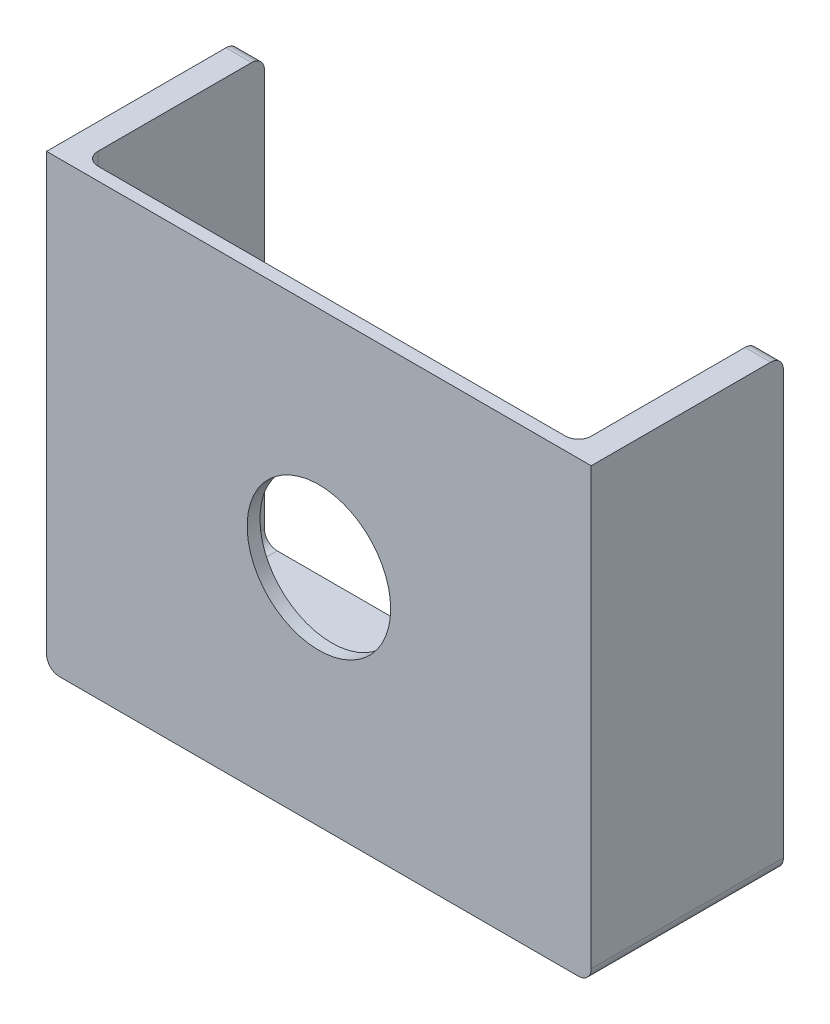
ISO-10303-21;
HEADER;
FILE_DESCRIPTION(('STEP AP214'),'2;1');
FILE_NAME('part.step','',(''),(''),'','','');
FILE_SCHEMA(('AUTOMOTIVE_DESIGN { 1 0 10303 214 1 1 1 1 }'));
ENDSEC;
DATA;
#1=APPLICATION_CONTEXT('core data for automotive mechanical design processes');
#2=APPLICATION_PROTOCOL_DEFINITION('international standard','automotive_design',2000,#1);
#3=PRODUCT_CONTEXT('',#1,'mechanical');
#4=PRODUCT('Part','Part','',(#3));
#5=PRODUCT_RELATED_PRODUCT_CATEGORY('part','',(#4));
#6=PRODUCT_DEFINITION_FORMATION('','',#4);
#7=PRODUCT_DEFINITION_CONTEXT('part definition',#1,'design');
#8=PRODUCT_DEFINITION('design','',#6,#7);
#9=PRODUCT_DEFINITION_SHAPE('','',#8);
#10=(LENGTH_UNIT() NAMED_UNIT(*) SI_UNIT(.MILLI.,.METRE.));
#11=(NAMED_UNIT(*) PLANE_ANGLE_UNIT() SI_UNIT($,.RADIAN.));
#12=(NAMED_UNIT(*) SI_UNIT($,.STERADIAN.) SOLID_ANGLE_UNIT());
#13=UNCERTAINTY_MEASURE_WITH_UNIT(LENGTH_MEASURE(1.E-05),#10,'distance_accuracy_value','');
#14=(GEOMETRIC_REPRESENTATION_CONTEXT(3) GLOBAL_UNCERTAINTY_ASSIGNED_CONTEXT((#13)) GLOBAL_UNIT_ASSIGNED_CONTEXT((#10,
#11,#12)) REPRESENTATION_CONTEXT('',''));
#15=CARTESIAN_POINT('',(0.,0.,0.));
#16=DIRECTION('',(0.,0.,1.));
#17=DIRECTION('',(1.,0.,0.));
#18=AXIS2_PLACEMENT_3D('',#15,#16,#17);
#19=CARTESIAN_POINT('',(0.,0.,0.));
#20=DIRECTION('',(0.,0.,-1.));
#21=DIRECTION('',(-1.,0.,0.));
#22=AXIS2_PLACEMENT_3D('',#19,#20,#21);
#23=PLANE('',#22);
#24=DIRECTION('',(-1.,0.,0.));
#25=VECTOR('',#24,1.);
#26=CARTESIAN_POINT('',(0.,70.,0.));
#27=LINE('',#26,#25);
#28=CARTESIAN_POINT('',(79.,70.,0.));
#29=VERTEX_POINT('',#28);
#30=CARTESIAN_POINT('',(6.,70.,0.));
#31=VERTEX_POINT('',#30);
#32=EDGE_CURVE('E185',#29,#31,#27,.T.);
#33=ORIENTED_EDGE('',*,*,#32,.F.);
#34=DIRECTION('',(0.,1.,0.));
#35=VECTOR('',#34,1.);
#36=CARTESIAN_POINT('',(79.,0.,0.));
#37=LINE('',#36,#35);
#38=CARTESIAN_POINT('',(79.,6.,0.));
#39=VERTEX_POINT('',#38);
#40=EDGE_CURVE('E235',#29,#39,#37,.F.);
#41=ORIENTED_EDGE('',*,*,#40,.T.);
#42=DIRECTION('',(1.,0.,0.));
#43=VECTOR('',#42,1.);
#44=CARTESIAN_POINT('',(4.,6.,0.));
#45=LINE('',#44,#43);
#46=CARTESIAN_POINT('',(6.,6.,0.));
#47=VERTEX_POINT('',#46);
#48=EDGE_CURVE('E231',#39,#47,#45,.F.);
#49=ORIENTED_EDGE('',*,*,#48,.T.);
#50=DIRECTION('',(0.,1.,0.));
#51=VECTOR('',#50,1.);
#52=CARTESIAN_POINT('',(6.,70.,0.));
#53=LINE('',#52,#51);
#54=EDGE_CURVE('E233',#47,#31,#53,.T.);
#55=ORIENTED_EDGE('',*,*,#54,.T.);
#56=EDGE_LOOP('',(#33,#41,#49,#55));
#57=FACE_BOUND('',#56,.T.);
#58=CARTESIAN_POINT('',(42.5,35.,0.));
#59=DIRECTION('',(0.,0.,-1.));
#60=DIRECTION('',(-1.,0.,0.));
#61=AXIS2_PLACEMENT_3D('',#58,#59,#60);
#62=CIRCLE('',#61,11.2);
#63=CARTESIAN_POINT('',(31.3,35.,0.));
#64=VERTEX_POINT('',#63);
#65=EDGE_CURVE('E188',#64,#64,#62,.T.);
#66=ORIENTED_EDGE('',*,*,#65,.F.);
#67=EDGE_LOOP('',(#66));
#68=FACE_BOUND('',#67,.T.);
#69=ADVANCED_FACE('F38',(#57,#68),#23,.T.);
#70=CARTESIAN_POINT('',(-28.2842712474619,4.,0.));
#71=DIRECTION('',(0.,1.,0.));
#72=DIRECTION('',(0.,0.,1.));
#73=AXIS2_PLACEMENT_3D('',#70,#71,#72);
#74=PLANE('',#73);
#75=CARTESIAN_POINT('',(15.,4.,-13.));
#76=DIRECTION('',(0.,1.,0.));
#77=DIRECTION('',(0.,0.,1.));
#78=AXIS2_PLACEMENT_3D('',#75,#76,#77);
#79=CIRCLE('',#78,2.39999999999999);
#80=CARTESIAN_POINT('',(15.,4.,-10.6));
#81=VERTEX_POINT('',#80);
#82=EDGE_CURVE('E262',#81,#81,#79,.T.);
#83=ORIENTED_EDGE('',*,*,#82,.F.);
#84=EDGE_LOOP('',(#83));
#85=FACE_BOUND('',#84,.T.);
#86=CARTESIAN_POINT('',(70.,4.,-13.));
#87=DIRECTION('',(0.,1.,0.));
#88=DIRECTION('',(0.,0.,1.));
#89=AXIS2_PLACEMENT_3D('',#86,#87,#88);
#90=CIRCLE('',#89,2.4);
#91=CARTESIAN_POINT('',(70.,4.,-10.6));
#92=VERTEX_POINT('',#91);
#93=EDGE_CURVE('E270',#92,#92,#90,.T.);
#94=ORIENTED_EDGE('',*,*,#93,.F.);
#95=EDGE_LOOP('',(#94));
#96=FACE_BOUND('',#95,.T.);
#97=DIRECTION('',(1.,0.,0.));
#98=VECTOR('',#97,1.);
#99=CARTESIAN_POINT('',(-28.2842712474619,4.,-28.));
#100=LINE('',#99,#98);
#101=CARTESIAN_POINT('',(6.,4.,-28.));
#102=VERTEX_POINT('',#101);
#103=CARTESIAN_POINT('',(79.,4.,-28.));
#104=VERTEX_POINT('',#103);
#105=EDGE_CURVE('E294',#102,#104,#100,.T.);
#106=ORIENTED_EDGE('',*,*,#105,.F.);
#107=DIRECTION('',(0.,0.,1.));
#108=VECTOR('',#107,1.);
#109=CARTESIAN_POINT('',(6.,4.,0.));
#110=LINE('',#109,#108);
#111=CARTESIAN_POINT('',(6.,4.,-2.));
#112=VERTEX_POINT('',#111);
#113=EDGE_CURVE('E55',#102,#112,#110,.T.);
#114=ORIENTED_EDGE('',*,*,#113,.T.);
#115=DIRECTION('',(1.,0.,0.));
#116=VECTOR('',#115,1.);
#117=CARTESIAN_POINT('',(81.,4.,-2.));
#118=LINE('',#117,#116);
#119=CARTESIAN_POINT('',(79.,4.,-2.));
#120=VERTEX_POINT('',#119);
#121=EDGE_CURVE('E60',#112,#120,#118,.T.);
#122=ORIENTED_EDGE('',*,*,#121,.T.);
#123=DIRECTION('',(0.,0.,1.));
#124=VECTOR('',#123,1.);
#125=CARTESIAN_POINT('',(79.,4.,0.));
#126=LINE('',#125,#124);
#127=EDGE_CURVE('E237',#120,#104,#126,.F.);
#128=ORIENTED_EDGE('',*,*,#127,.T.);
#129=EDGE_LOOP('',(#106,#114,#122,#128));
#130=FACE_BOUND('',#129,.T.);
#131=ADVANCED_FACE('F364',(#85,#96,#130),#74,.T.);
#132=CARTESIAN_POINT('',(0.,0.,2.));
#133=DIRECTION('',(1.,0.,0.));
#134=DIRECTION('',(0.,0.,-1.));
#135=AXIS2_PLACEMENT_3D('',#132,#133,#134);
#136=PLANE('',#135);
#137=DIRECTION('',(0.,-1.,0.));
#138=VECTOR('',#137,1.);
#139=CARTESIAN_POINT('',(0.,0.,-28.));
#140=LINE('',#139,#138);
#141=CARTESIAN_POINT('',(0.,68.,-28.));
#142=VERTEX_POINT('',#141);
#143=CARTESIAN_POINT('',(0.,2.,-28.));
#144=VERTEX_POINT('',#143);
#145=EDGE_CURVE('E290',#142,#144,#140,.T.);
#146=ORIENTED_EDGE('',*,*,#145,.T.);
#147=DIRECTION('',(0.,0.,-1.));
#148=VECTOR('',#147,1.);
#149=CARTESIAN_POINT('',(0.,2.,2.));
#150=LINE('',#149,#148);
#151=CARTESIAN_POINT('',(0.,2.,2.));
#152=VERTEX_POINT('',#151);
#153=EDGE_CURVE('E212',#144,#152,#150,.F.);
#154=ORIENTED_EDGE('',*,*,#153,.T.);
#155=DIRECTION('',(0.,-1.,0.));
#156=VECTOR('',#155,1.);
#157=CARTESIAN_POINT('',(0.,0.,2.));
#158=LINE('',#157,#156);
#159=CARTESIAN_POINT('',(0.,70.,2.));
#160=VERTEX_POINT('',#159);
#161=EDGE_CURVE('E187',#160,#152,#158,.T.);
#162=ORIENTED_EDGE('',*,*,#161,.F.);
#163=DIRECTION('',(0.,0.,-1.));
#164=VECTOR('',#163,1.);
#165=CARTESIAN_POINT('',(0.,70.,2.));
#166=LINE('',#165,#164);
#167=CARTESIAN_POINT('',(0.,70.,-26.));
#168=VERTEX_POINT('',#167);
#169=EDGE_CURVE('E175',#160,#168,#166,.T.);
#170=ORIENTED_EDGE('',*,*,#169,.T.);
#171=CARTESIAN_POINT('',(0.,68.,-26.));
#172=DIRECTION('',(1.,0.,0.));
#173=DIRECTION('',(0.,0.,-1.));
#174=AXIS2_PLACEMENT_3D('',#171,#172,#173);
#175=CIRCLE('',#174,2.);
#176=EDGE_CURVE('E210',#168,#142,#175,.F.);
#177=ORIENTED_EDGE('',*,*,#176,.T.);
#178=EDGE_LOOP('',(#146,#154,#162,#170,#177));
#179=FACE_BOUND('',#178,.T.);
#180=ADVANCED_FACE('F352',(#179),#136,.F.);
#181=CARTESIAN_POINT('',(0.,0.,2.));
#182=DIRECTION('',(0.,1.,0.));
#183=DIRECTION('',(0.,0.,1.));
#184=AXIS2_PLACEMENT_3D('',#181,#182,#183);
#185=PLANE('',#184);
#186=CARTESIAN_POINT('',(15.,0.,-13.));
#187=DIRECTION('',(0.,1.,0.));
#188=DIRECTION('',(0.,0.,1.));
#189=AXIS2_PLACEMENT_3D('',#186,#187,#188);
#190=CIRCLE('',#189,2.4);
#191=CARTESIAN_POINT('',(15.,0.,-10.6));
#192=VERTEX_POINT('',#191);
#193=EDGE_CURVE('E265',#192,#192,#190,.T.);
#194=ORIENTED_EDGE('',*,*,#193,.T.);
#195=EDGE_LOOP('',(#194));
#196=FACE_BOUND('',#195,.T.);
#197=CARTESIAN_POINT('',(70.,0.,-13.));
#198=DIRECTION('',(0.,1.,0.));
#199=DIRECTION('',(0.,0.,1.));
#200=AXIS2_PLACEMENT_3D('',#197,#198,#199);
#201=CIRCLE('',#200,2.4);
#202=CARTESIAN_POINT('',(70.,0.,-10.6));
#203=VERTEX_POINT('',#202);
#204=EDGE_CURVE('E275',#203,#203,#201,.T.);
#205=ORIENTED_EDGE('',*,*,#204,.T.);
#206=EDGE_LOOP('',(#205));
#207=FACE_BOUND('',#206,.T.);
#208=DIRECTION('',(1.,0.,0.));
#209=VECTOR('',#208,1.);
#210=CARTESIAN_POINT('',(-28.2842712474619,0.,-28.));
#211=LINE('',#210,#209);
#212=CARTESIAN_POINT('',(2.,0.,-28.));
#213=VERTEX_POINT('',#212);
#214=CARTESIAN_POINT('',(83.,0.,-28.));
#215=VERTEX_POINT('',#214);
#216=EDGE_CURVE('E296',#213,#215,#211,.T.);
#217=ORIENTED_EDGE('',*,*,#216,.T.);
#218=DIRECTION('',(0.,0.,-1.));
#219=VECTOR('',#218,1.);
#220=CARTESIAN_POINT('',(83.,0.,2.));
#221=LINE('',#220,#219);
#222=CARTESIAN_POINT('',(83.,0.,2.));
#223=VERTEX_POINT('',#222);
#224=EDGE_CURVE('E205',#215,#223,#221,.F.);
#225=ORIENTED_EDGE('',*,*,#224,.T.);
#226=DIRECTION('',(1.,0.,0.));
#227=VECTOR('',#226,1.);
#228=CARTESIAN_POINT('',(0.,0.,2.));
#229=LINE('',#228,#227);
#230=CARTESIAN_POINT('',(2.,0.,2.));
#231=VERTEX_POINT('',#230);
#232=EDGE_CURVE('E164',#231,#223,#229,.T.);
#233=ORIENTED_EDGE('',*,*,#232,.F.);
#234=DIRECTION('',(0.,0.,-1.));
#235=VECTOR('',#234,1.);
#236=CARTESIAN_POINT('',(2.,0.,2.));
#237=LINE('',#236,#235);
#238=EDGE_CURVE('E202',#231,#213,#237,.T.);
#239=ORIENTED_EDGE('',*,*,#238,.T.);
#240=EDGE_LOOP('',(#217,#225,#233,#239));
#241=FACE_BOUND('',#240,.T.);
#242=ADVANCED_FACE('F355',(#196,#207,#241),#185,.F.);
#243=CARTESIAN_POINT('',(85.,0.,2.));
#244=DIRECTION('',(-1.,0.,0.));
#245=DIRECTION('',(0.,0.,1.));
#246=AXIS2_PLACEMENT_3D('',#243,#244,#245);
#247=PLANE('',#246);
#248=DIRECTION('',(0.,1.,0.));
#249=VECTOR('',#248,1.);
#250=CARTESIAN_POINT('',(85.,0.,2.));
#251=LINE('',#250,#249);
#252=CARTESIAN_POINT('',(85.,2.,2.));
#253=VERTEX_POINT('',#252);
#254=CARTESIAN_POINT('',(85.,70.,2.));
#255=VERTEX_POINT('',#254);
#256=EDGE_CURVE('E151',#253,#255,#251,.T.);
#257=ORIENTED_EDGE('',*,*,#256,.F.);
#258=DIRECTION('',(0.,0.,-1.));
#259=VECTOR('',#258,1.);
#260=CARTESIAN_POINT('',(85.,2.,2.));
#261=LINE('',#260,#259);
#262=CARTESIAN_POINT('',(85.,2.,-28.));
#263=VERTEX_POINT('',#262);
#264=EDGE_CURVE('E191',#253,#263,#261,.T.);
#265=ORIENTED_EDGE('',*,*,#264,.T.);
#266=DIRECTION('',(0.,1.,0.));
#267=VECTOR('',#266,1.);
#268=CARTESIAN_POINT('',(85.,0.,-28.));
#269=LINE('',#268,#267);
#270=CARTESIAN_POINT('',(85.,68.,-28.));
#271=VERTEX_POINT('',#270);
#272=EDGE_CURVE('E287',#263,#271,#269,.T.);
#273=ORIENTED_EDGE('',*,*,#272,.T.);
#274=CARTESIAN_POINT('',(85.,68.,-26.));
#275=DIRECTION('',(-1.,0.,0.));
#276=DIRECTION('',(0.,0.,1.));
#277=AXIS2_PLACEMENT_3D('',#274,#275,#276);
#278=CIRCLE('',#277,2.);
#279=CARTESIAN_POINT('',(85.,70.,-26.));
#280=VERTEX_POINT('',#279);
#281=EDGE_CURVE('E171',#271,#280,#278,.F.);
#282=ORIENTED_EDGE('',*,*,#281,.T.);
#283=DIRECTION('',(0.,0.,-1.));
#284=VECTOR('',#283,1.);
#285=CARTESIAN_POINT('',(85.,70.,2.));
#286=LINE('',#285,#284);
#287=EDGE_CURVE('E167',#255,#280,#286,.T.);
#288=ORIENTED_EDGE('',*,*,#287,.F.);
#289=EDGE_LOOP('',(#257,#265,#273,#282,#288));
#290=FACE_BOUND('',#289,.T.);
#291=ADVANCED_FACE('F168',(#290),#247,.F.);
#292=CARTESIAN_POINT('',(0.,70.,2.));
#293=DIRECTION('',(0.,-1.,0.));
#294=DIRECTION('',(0.,0.,-1.));
#295=AXIS2_PLACEMENT_3D('',#292,#293,#294);
#296=PLANE('',#295);
#297=DIRECTION('',(0.,0.,-1.));
#298=VECTOR('',#297,1.);
#299=CARTESIAN_POINT('',(4.,70.,0.));
#300=LINE('',#299,#298);
#301=CARTESIAN_POINT('',(4.,70.,-2.));
#302=VERTEX_POINT('',#301);
#303=CARTESIAN_POINT('',(4.,70.,-26.));
#304=VERTEX_POINT('',#303);
#305=EDGE_CURVE('E278',#302,#304,#300,.T.);
#306=ORIENTED_EDGE('',*,*,#305,.T.);
#307=DIRECTION('',(1.,0.,0.));
#308=VECTOR('',#307,1.);
#309=CARTESIAN_POINT('',(0.,70.,-26.));
#310=LINE('',#309,#308);
#311=EDGE_CURVE('E222',#304,#168,#310,.F.);
#312=ORIENTED_EDGE('',*,*,#311,.T.);
#313=ORIENTED_EDGE('',*,*,#169,.F.);
#314=DIRECTION('',(-1.,0.,0.));
#315=VECTOR('',#314,1.);
#316=CARTESIAN_POINT('',(0.,70.,2.));
#317=LINE('',#316,#315);
#318=EDGE_CURVE('E157',#255,#160,#317,.T.);
#319=ORIENTED_EDGE('',*,*,#318,.F.);
#320=ORIENTED_EDGE('',*,*,#287,.T.);
#321=DIRECTION('',(-1.,0.,0.));
#322=VECTOR('',#321,1.);
#323=CARTESIAN_POINT('',(81.,70.,-26.));
#324=LINE('',#323,#322);
#325=CARTESIAN_POINT('',(81.,70.,-26.));
#326=VERTEX_POINT('',#325);
#327=EDGE_CURVE('E220',#280,#326,#324,.T.);
#328=ORIENTED_EDGE('',*,*,#327,.T.);
#329=DIRECTION('',(0.,0.,-1.));
#330=VECTOR('',#329,1.);
#331=CARTESIAN_POINT('',(81.,70.,0.));
#332=LINE('',#331,#330);
#333=CARTESIAN_POINT('',(81.,70.,-2.));
#334=VERTEX_POINT('',#333);
#335=EDGE_CURVE('E284',#334,#326,#332,.T.);
#336=ORIENTED_EDGE('',*,*,#335,.F.);
#337=CARTESIAN_POINT('',(79.,70.,-2.));
#338=DIRECTION('',(0.,-1.,0.));
#339=DIRECTION('',(0.,0.,-1.));
#340=AXIS2_PLACEMENT_3D('',#337,#338,#339);
#341=CIRCLE('',#340,2.);
#342=EDGE_CURVE('E241',#334,#29,#341,.T.);
#343=ORIENTED_EDGE('',*,*,#342,.T.);
#344=ORIENTED_EDGE('',*,*,#32,.T.);
#345=CARTESIAN_POINT('',(6.,70.,-2.));
#346=DIRECTION('',(0.,-1.,0.));
#347=DIRECTION('',(0.,0.,-1.));
#348=AXIS2_PLACEMENT_3D('',#345,#346,#347);
#349=CIRCLE('',#348,2.);
#350=EDGE_CURVE('E243',#31,#302,#349,.T.);
#351=ORIENTED_EDGE('',*,*,#350,.T.);
#352=EDGE_LOOP('',(#306,#312,#313,#319,#320,#328,#336,#343,#344,#351));
#353=FACE_BOUND('',#352,.T.);
#354=ADVANCED_FACE('F178',(#353),#296,.F.);
#355=CARTESIAN_POINT('',(0.,0.,2.));
#356=DIRECTION('',(0.,0.,-1.));
#357=DIRECTION('',(-1.,0.,0.));
#358=AXIS2_PLACEMENT_3D('',#355,#356,#357);
#359=PLANE('',#358);
#360=CARTESIAN_POINT('',(42.5,35.,2.));
#361=DIRECTION('',(0.,0.,1.));
#362=DIRECTION('',(1.,0.,0.));
#363=AXIS2_PLACEMENT_3D('',#360,#361,#362);
#364=CIRCLE('',#363,11.2);
#365=CARTESIAN_POINT('',(53.7,35.,2.));
#366=VERTEX_POINT('',#365);
#367=EDGE_CURVE('E293',#366,#366,#364,.T.);
#368=ORIENTED_EDGE('',*,*,#367,.F.);
#369=EDGE_LOOP('',(#368));
#370=FACE_BOUND('',#369,.T.);
#371=ORIENTED_EDGE('',*,*,#232,.T.);
#372=CARTESIAN_POINT('',(83.,2.,2.));
#373=DIRECTION('',(0.,0.,-1.));
#374=DIRECTION('',(-1.,0.,0.));
#375=AXIS2_PLACEMENT_3D('',#372,#373,#374);
#376=CIRCLE('',#375,2.);
#377=EDGE_CURVE('E160',#223,#253,#376,.F.);
#378=ORIENTED_EDGE('',*,*,#377,.T.);
#379=ORIENTED_EDGE('',*,*,#256,.T.);
#380=ORIENTED_EDGE('',*,*,#318,.T.);
#381=ORIENTED_EDGE('',*,*,#161,.T.);
#382=CARTESIAN_POINT('',(2.,2.,2.));
#383=DIRECTION('',(0.,0.,-1.));
#384=DIRECTION('',(-1.,0.,0.));
#385=AXIS2_PLACEMENT_3D('',#382,#383,#384);
#386=CIRCLE('',#385,2.);
#387=EDGE_CURVE('E207',#152,#231,#386,.F.);
#388=ORIENTED_EDGE('',*,*,#387,.T.);
#389=EDGE_LOOP('',(#371,#378,#379,#380,#381,#388));
#390=FACE_BOUND('',#389,.T.);
#391=ADVANCED_FACE('F154',(#370,#390),#359,.F.);
#392=CARTESIAN_POINT('',(42.5,35.,2.));
#393=DIRECTION('',(0.,0.,1.));
#394=DIRECTION('',(1.,0.,0.));
#395=AXIS2_PLACEMENT_3D('',#392,#393,#394);
#396=CYLINDRICAL_SURFACE('',#395,11.2);
#397=ORIENTED_EDGE('',*,*,#367,.T.);
#398=EDGE_LOOP('',(#397));
#399=FACE_BOUND('',#398,.T.);
#400=ORIENTED_EDGE('',*,*,#65,.T.);
#401=EDGE_LOOP('',(#400));
#402=FACE_BOUND('',#401,.T.);
#403=ADVANCED_FACE('F381',(#399,#402),#396,.F.);
#404=CARTESIAN_POINT('',(-28.2842712474619,0.,-28.));
#405=DIRECTION('',(0.,0.,-1.));
#406=DIRECTION('',(-1.,0.,0.));
#407=AXIS2_PLACEMENT_3D('',#404,#405,#406);
#408=PLANE('',#407);
#409=ORIENTED_EDGE('',*,*,#272,.F.);
#410=CARTESIAN_POINT('',(83.,2.,-28.));
#411=DIRECTION('',(0.,0.,-1.));
#412=DIRECTION('',(-1.,0.,0.));
#413=AXIS2_PLACEMENT_3D('',#410,#411,#412);
#414=CIRCLE('',#413,2.);
#415=EDGE_CURVE('E200',#263,#215,#414,.T.);
#416=ORIENTED_EDGE('',*,*,#415,.T.);
#417=ORIENTED_EDGE('',*,*,#216,.F.);
#418=CARTESIAN_POINT('',(2.,2.,-28.));
#419=DIRECTION('',(0.,0.,-1.));
#420=DIRECTION('',(-1.,0.,0.));
#421=AXIS2_PLACEMENT_3D('',#418,#419,#420);
#422=CIRCLE('',#421,2.);
#423=EDGE_CURVE('E198',#213,#144,#422,.T.);
#424=ORIENTED_EDGE('',*,*,#423,.T.);
#425=ORIENTED_EDGE('',*,*,#145,.F.);
#426=DIRECTION('',(1.,0.,0.));
#427=VECTOR('',#426,1.);
#428=CARTESIAN_POINT('',(4.,68.,-28.));
#429=LINE('',#428,#427);
#430=CARTESIAN_POINT('',(4.,68.,-28.));
#431=VERTEX_POINT('',#430);
#432=EDGE_CURVE('E195',#142,#431,#429,.T.);
#433=ORIENTED_EDGE('',*,*,#432,.T.);
#434=DIRECTION('',(0.,1.,0.));
#435=VECTOR('',#434,1.);
#436=CARTESIAN_POINT('',(4.,-0.002000000000002,-28.));
#437=LINE('',#436,#435);
#438=CARTESIAN_POINT('',(4.,6.,-28.));
#439=VERTEX_POINT('',#438);
#440=EDGE_CURVE('E280',#439,#431,#437,.T.);
#441=ORIENTED_EDGE('',*,*,#440,.F.);
#442=CARTESIAN_POINT('',(6.,6.,-28.));
#443=DIRECTION('',(0.,0.,-1.));
#444=DIRECTION('',(-1.,0.,0.));
#445=AXIS2_PLACEMENT_3D('',#442,#443,#444);
#446=CIRCLE('',#445,2.);
#447=EDGE_CURVE('E47',#439,#102,#446,.F.);
#448=ORIENTED_EDGE('',*,*,#447,.T.);
#449=ORIENTED_EDGE('',*,*,#105,.T.);
#450=CARTESIAN_POINT('',(79.,6.,-28.));
#451=DIRECTION('',(0.,0.,-1.));
#452=DIRECTION('',(-1.,0.,0.));
#453=AXIS2_PLACEMENT_3D('',#450,#451,#452);
#454=CIRCLE('',#453,2.);
#455=CARTESIAN_POINT('',(81.,6.,-28.));
#456=VERTEX_POINT('',#455);
#457=EDGE_CURVE('E11',#104,#456,#454,.F.);
#458=ORIENTED_EDGE('',*,*,#457,.T.);
#459=DIRECTION('',(0.,1.,0.));
#460=VECTOR('',#459,1.);
#461=CARTESIAN_POINT('',(81.,-0.002000000000002,-28.));
#462=LINE('',#461,#460);
#463=CARTESIAN_POINT('',(81.,68.,-28.));
#464=VERTEX_POINT('',#463);
#465=EDGE_CURVE('E283',#456,#464,#462,.T.);
#466=ORIENTED_EDGE('',*,*,#465,.T.);
#467=DIRECTION('',(-1.,0.,0.));
#468=VECTOR('',#467,1.);
#469=CARTESIAN_POINT('',(85.,68.,-28.));
#470=LINE('',#469,#468);
#471=EDGE_CURVE('E193',#464,#271,#470,.F.);
#472=ORIENTED_EDGE('',*,*,#471,.T.);
#473=EDGE_LOOP('',(#409,#416,#417,#424,#425,#433,#441,#448,#449,#458,#466,#472));
#474=FACE_BOUND('',#473,.T.);
#475=ADVANCED_FACE('F314',(#474),#408,.T.);
#476=CARTESIAN_POINT('',(81.,-0.002000000000002,0.));
#477=DIRECTION('',(1.,0.,0.));
#478=DIRECTION('',(0.,0.,-1.));
#479=AXIS2_PLACEMENT_3D('',#476,#477,#478);
#480=PLANE('',#479);
#481=ORIENTED_EDGE('',*,*,#335,.T.);
#482=CARTESIAN_POINT('',(81.,68.,-26.));
#483=DIRECTION('',(1.,0.,0.));
#484=DIRECTION('',(0.,0.,-1.));
#485=AXIS2_PLACEMENT_3D('',#482,#483,#484);
#486=CIRCLE('',#485,2.);
#487=EDGE_CURVE('E229',#326,#464,#486,.F.);
#488=ORIENTED_EDGE('',*,*,#487,.T.);
#489=ORIENTED_EDGE('',*,*,#465,.F.);
#490=DIRECTION('',(0.,0.,1.));
#491=VECTOR('',#490,1.);
#492=CARTESIAN_POINT('',(81.,6.,0.));
#493=LINE('',#492,#491);
#494=CARTESIAN_POINT('',(81.,6.,-2.));
#495=VERTEX_POINT('',#494);
#496=EDGE_CURVE('E224',#456,#495,#493,.T.);
#497=ORIENTED_EDGE('',*,*,#496,.T.);
#498=DIRECTION('',(0.,1.,0.));
#499=VECTOR('',#498,1.);
#500=CARTESIAN_POINT('',(81.,-0.002000000000002,-2.));
#501=LINE('',#500,#499);
#502=EDGE_CURVE('E226',#495,#334,#501,.T.);
#503=ORIENTED_EDGE('',*,*,#502,.T.);
#504=EDGE_LOOP('',(#481,#488,#489,#497,#503));
#505=FACE_BOUND('',#504,.T.);
#506=ADVANCED_FACE('F322',(#505),#480,.F.);
#507=CARTESIAN_POINT('',(4.,-0.002000000000002,0.));
#508=DIRECTION('',(1.,0.,0.));
#509=DIRECTION('',(0.,0.,-1.));
#510=AXIS2_PLACEMENT_3D('',#507,#508,#509);
#511=PLANE('',#510);
#512=ORIENTED_EDGE('',*,*,#440,.T.);
#513=CARTESIAN_POINT('',(4.,68.,-26.));
#514=DIRECTION('',(1.,0.,0.));
#515=DIRECTION('',(0.,0.,-1.));
#516=AXIS2_PLACEMENT_3D('',#513,#514,#515);
#517=CIRCLE('',#516,2.);
#518=EDGE_CURVE('E218',#431,#304,#517,.T.);
#519=ORIENTED_EDGE('',*,*,#518,.T.);
#520=ORIENTED_EDGE('',*,*,#305,.F.);
#521=DIRECTION('',(0.,1.,0.));
#522=VECTOR('',#521,1.);
#523=CARTESIAN_POINT('',(4.,4.,-2.));
#524=LINE('',#523,#522);
#525=CARTESIAN_POINT('',(4.,6.,-2.));
#526=VERTEX_POINT('',#525);
#527=EDGE_CURVE('E216',#302,#526,#524,.F.);
#528=ORIENTED_EDGE('',*,*,#527,.T.);
#529=DIRECTION('',(0.,0.,1.));
#530=VECTOR('',#529,1.);
#531=CARTESIAN_POINT('',(4.,6.,-28.));
#532=LINE('',#531,#530);
#533=EDGE_CURVE('E214',#526,#439,#532,.F.);
#534=ORIENTED_EDGE('',*,*,#533,.T.);
#535=EDGE_LOOP('',(#512,#519,#520,#528,#534));
#536=FACE_BOUND('',#535,.T.);
#537=ADVANCED_FACE('F341',(#536),#511,.T.);
#538=CARTESIAN_POINT('',(70.,4.,-13.));
#539=DIRECTION('',(0.,1.,0.));
#540=DIRECTION('',(0.,0.,1.));
#541=AXIS2_PLACEMENT_3D('',#538,#539,#540);
#542=CYLINDRICAL_SURFACE('',#541,2.4);
#543=ORIENTED_EDGE('',*,*,#204,.F.);
#544=EDGE_LOOP('',(#543));
#545=FACE_BOUND('',#544,.T.);
#546=ORIENTED_EDGE('',*,*,#93,.T.);
#547=EDGE_LOOP('',(#546));
#548=FACE_BOUND('',#547,.T.);
#549=ADVANCED_FACE('F399',(#545,#548),#542,.F.);
#550=CARTESIAN_POINT('',(15.,4.,-13.));
#551=DIRECTION('',(0.,1.,0.));
#552=DIRECTION('',(0.,0.,1.));
#553=AXIS2_PLACEMENT_3D('',#550,#551,#552);
#554=CYLINDRICAL_SURFACE('',#553,2.4);
#555=ORIENTED_EDGE('',*,*,#193,.F.);
#556=EDGE_LOOP('',(#555));
#557=FACE_BOUND('',#556,.T.);
#558=ORIENTED_EDGE('',*,*,#82,.T.);
#559=EDGE_LOOP('',(#558));
#560=FACE_BOUND('',#559,.T.);
#561=ADVANCED_FACE('F402',(#557,#560),#554,.F.);
#562=CARTESIAN_POINT('',(83.,2.,2.));
#563=DIRECTION('',(0.,0.,-1.));
#564=DIRECTION('',(-1.,0.,0.));
#565=AXIS2_PLACEMENT_3D('',#562,#563,#564);
#566=CYLINDRICAL_SURFACE('',#565,2.);
#567=ORIENTED_EDGE('',*,*,#377,.F.);
#568=ORIENTED_EDGE('',*,*,#224,.F.);
#569=ORIENTED_EDGE('',*,*,#415,.F.);
#570=ORIENTED_EDGE('',*,*,#264,.F.);
#571=EDGE_LOOP('',(#567,#568,#569,#570));
#572=FACE_BOUND('',#571,.T.);
#573=ADVANCED_FACE('F311',(#572),#566,.T.);
#574=CARTESIAN_POINT('',(2.,2.,2.));
#575=DIRECTION('',(0.,0.,-1.));
#576=DIRECTION('',(-1.,0.,0.));
#577=AXIS2_PLACEMENT_3D('',#574,#575,#576);
#578=CYLINDRICAL_SURFACE('',#577,2.);
#579=ORIENTED_EDGE('',*,*,#387,.F.);
#580=ORIENTED_EDGE('',*,*,#153,.F.);
#581=ORIENTED_EDGE('',*,*,#423,.F.);
#582=ORIENTED_EDGE('',*,*,#238,.F.);
#583=EDGE_LOOP('',(#579,#580,#581,#582));
#584=FACE_BOUND('',#583,.T.);
#585=ADVANCED_FACE('F354',(#584),#578,.T.);
#586=CARTESIAN_POINT('',(-28.2842712474619,68.,-26.));
#587=DIRECTION('',(-1.,0.,0.));
#588=DIRECTION('',(0.,0.,1.));
#589=AXIS2_PLACEMENT_3D('',#586,#587,#588);
#590=CYLINDRICAL_SURFACE('',#589,2.);
#591=ORIENTED_EDGE('',*,*,#176,.F.);
#592=ORIENTED_EDGE('',*,*,#311,.F.);
#593=ORIENTED_EDGE('',*,*,#518,.F.);
#594=ORIENTED_EDGE('',*,*,#432,.F.);
#595=EDGE_LOOP('',(#591,#592,#593,#594));
#596=FACE_BOUND('',#595,.T.);
#597=ADVANCED_FACE('F347',(#596),#590,.T.);
#598=CARTESIAN_POINT('',(0.,68.,-26.));
#599=DIRECTION('',(1.,0.,0.));
#600=DIRECTION('',(0.,0.,-1.));
#601=AXIS2_PLACEMENT_3D('',#598,#599,#600);
#602=CYLINDRICAL_SURFACE('',#601,2.);
#603=ORIENTED_EDGE('',*,*,#281,.F.);
#604=ORIENTED_EDGE('',*,*,#471,.F.);
#605=ORIENTED_EDGE('',*,*,#487,.F.);
#606=ORIENTED_EDGE('',*,*,#327,.F.);
#607=EDGE_LOOP('',(#603,#604,#605,#606));
#608=FACE_BOUND('',#607,.T.);
#609=ADVANCED_FACE('F319',(#608),#602,.T.);
#610=CARTESIAN_POINT('',(6.,0.,-2.));
#611=DIRECTION('',(0.,-1.,0.));
#612=DIRECTION('',(0.,0.,-1.));
#613=AXIS2_PLACEMENT_3D('',#610,#611,#612);
#614=CYLINDRICAL_SURFACE('',#613,2.);
#615=ORIENTED_EDGE('',*,*,#350,.F.);
#616=ORIENTED_EDGE('',*,*,#54,.F.);
#617=CARTESIAN_POINT('',(6.,6.,-2.));
#618=DIRECTION('',(0.,1.,0.));
#619=DIRECTION('',(0.,0.,1.));
#620=AXIS2_PLACEMENT_3D('',#617,#618,#619);
#621=CIRCLE('',#620,2.);
#622=EDGE_CURVE('E42',#526,#47,#621,.T.);
#623=ORIENTED_EDGE('',*,*,#622,.F.);
#624=ORIENTED_EDGE('',*,*,#527,.F.);
#625=EDGE_LOOP('',(#615,#616,#623,#624));
#626=FACE_BOUND('',#625,.T.);
#627=ADVANCED_FACE('F40',(#626),#614,.F.);
#628=CARTESIAN_POINT('',(6.,6.,0.));
#629=DIRECTION('',(0.,0.,-1.));
#630=DIRECTION('',(-1.,0.,0.));
#631=AXIS2_PLACEMENT_3D('',#628,#629,#630);
#632=CYLINDRICAL_SURFACE('',#631,2.);
#633=ORIENTED_EDGE('',*,*,#447,.F.);
#634=ORIENTED_EDGE('',*,*,#533,.F.);
#635=CARTESIAN_POINT('',(6.,6.,-2.));
#636=DIRECTION('',(0.,0.,-1.));
#637=DIRECTION('',(-1.,0.,0.));
#638=AXIS2_PLACEMENT_3D('',#635,#636,#637);
#639=CIRCLE('',#638,2.);
#640=EDGE_CURVE('E257',#112,#526,#639,.T.);
#641=ORIENTED_EDGE('',*,*,#640,.F.);
#642=ORIENTED_EDGE('',*,*,#113,.F.);
#643=EDGE_LOOP('',(#633,#634,#641,#642));
#644=FACE_BOUND('',#643,.T.);
#645=ADVANCED_FACE('F436',(#644),#632,.F.);
#646=CARTESIAN_POINT('',(6.,6.,-2.));
#647=DIRECTION('',(-1.,0.,0.));
#648=DIRECTION('',(0.,0.,1.));
#649=AXIS2_PLACEMENT_3D('',#646,#647,#648);
#650=SPHERICAL_SURFACE('',#649,2.);
#651=ORIENTED_EDGE('',*,*,#640,.T.);
#652=ORIENTED_EDGE('',*,*,#622,.T.);
#653=CARTESIAN_POINT('',(6.,6.,-2.));
#654=DIRECTION('',(1.,0.,0.));
#655=DIRECTION('',(0.,1.,0.));
#656=AXIS2_PLACEMENT_3D('',#653,#654,#655);
#657=CIRCLE('',#656,2.);
#658=EDGE_CURVE('E255',#112,#47,#657,.F.);
#659=ORIENTED_EDGE('',*,*,#658,.F.);
#660=EDGE_LOOP('',(#651,#652,#659));
#661=FACE_BOUND('',#660,.T.);
#662=ADVANCED_FACE('F433',(#661),#650,.F.);
#663=CARTESIAN_POINT('',(-28.2842712474619,6.,-2.));
#664=DIRECTION('',(-1.,0.,0.));
#665=DIRECTION('',(0.,0.,1.));
#666=AXIS2_PLACEMENT_3D('',#663,#664,#665);
#667=CYLINDRICAL_SURFACE('',#666,2.);
#668=ORIENTED_EDGE('',*,*,#658,.T.);
#669=ORIENTED_EDGE('',*,*,#48,.F.);
#670=CARTESIAN_POINT('',(79.,6.,-2.));
#671=DIRECTION('',(-1.,0.,0.));
#672=DIRECTION('',(0.,0.,1.));
#673=AXIS2_PLACEMENT_3D('',#670,#671,#672);
#674=CIRCLE('',#673,2.);
#675=EDGE_CURVE('E252',#120,#39,#674,.T.);
#676=ORIENTED_EDGE('',*,*,#675,.F.);
#677=ORIENTED_EDGE('',*,*,#121,.F.);
#678=EDGE_LOOP('',(#668,#669,#676,#677));
#679=FACE_BOUND('',#678,.T.);
#680=ADVANCED_FACE('F429',(#679),#667,.F.);
#681=CARTESIAN_POINT('',(79.,6.,0.));
#682=DIRECTION('',(0.,0.,1.));
#683=DIRECTION('',(1.,0.,0.));
#684=AXIS2_PLACEMENT_3D('',#681,#682,#683);
#685=CYLINDRICAL_SURFACE('',#684,2.);
#686=ORIENTED_EDGE('',*,*,#457,.F.);
#687=ORIENTED_EDGE('',*,*,#127,.F.);
#688=CARTESIAN_POINT('',(79.,6.,-2.));
#689=DIRECTION('',(0.,0.,-1.));
#690=DIRECTION('',(-1.,0.,0.));
#691=AXIS2_PLACEMENT_3D('',#688,#689,#690);
#692=CIRCLE('',#691,2.);
#693=EDGE_CURVE('E249',#495,#120,#692,.T.);
#694=ORIENTED_EDGE('',*,*,#693,.F.);
#695=ORIENTED_EDGE('',*,*,#496,.F.);
#696=EDGE_LOOP('',(#686,#687,#694,#695));
#697=FACE_BOUND('',#696,.T.);
#698=ADVANCED_FACE('F425',(#697),#685,.F.);
#699=CARTESIAN_POINT('',(79.,6.,-2.));
#700=DIRECTION('',(0.,-1.,0.));
#701=DIRECTION('',(0.,0.,-1.));
#702=AXIS2_PLACEMENT_3D('',#699,#700,#701);
#703=SPHERICAL_SURFACE('',#702,2.);
#704=ORIENTED_EDGE('',*,*,#693,.T.);
#705=ORIENTED_EDGE('',*,*,#675,.T.);
#706=CARTESIAN_POINT('',(79.,6.,-2.));
#707=DIRECTION('',(0.,1.,0.));
#708=DIRECTION('',(0.,0.,1.));
#709=AXIS2_PLACEMENT_3D('',#706,#707,#708);
#710=CIRCLE('',#709,2.);
#711=EDGE_CURVE('E246',#495,#39,#710,.F.);
#712=ORIENTED_EDGE('',*,*,#711,.F.);
#713=EDGE_LOOP('',(#704,#705,#712));
#714=FACE_BOUND('',#713,.T.);
#715=ADVANCED_FACE('F422',(#714),#703,.F.);
#716=CARTESIAN_POINT('',(79.,-0.002000000000002,-2.));
#717=DIRECTION('',(0.,1.,0.));
#718=DIRECTION('',(0.,0.,1.));
#719=AXIS2_PLACEMENT_3D('',#716,#717,#718);
#720=CYLINDRICAL_SURFACE('',#719,2.);
#721=ORIENTED_EDGE('',*,*,#711,.T.);
#722=ORIENTED_EDGE('',*,*,#40,.F.);
#723=ORIENTED_EDGE('',*,*,#342,.F.);
#724=ORIENTED_EDGE('',*,*,#502,.F.);
#725=EDGE_LOOP('',(#721,#722,#723,#724));
#726=FACE_BOUND('',#725,.T.);
#727=ADVANCED_FACE('F327',(#726),#720,.F.);
#728=CLOSED_SHELL('',(#69,#131,#180,#242,#291,#354,#391,#403,#475,#506,#537,#549,#561,#573,#585,
#597,#609,#627,#645,#662,#680,#698,#715,#727));
#729=MANIFOLD_SOLID_BREP('B2',#728);
#730=ADVANCED_BREP_SHAPE_REPRESENTATION('',(#18,#729),#14);
#731=SHAPE_DEFINITION_REPRESENTATION(#9,#730);
ENDSEC;
END-ISO-10303-21;
